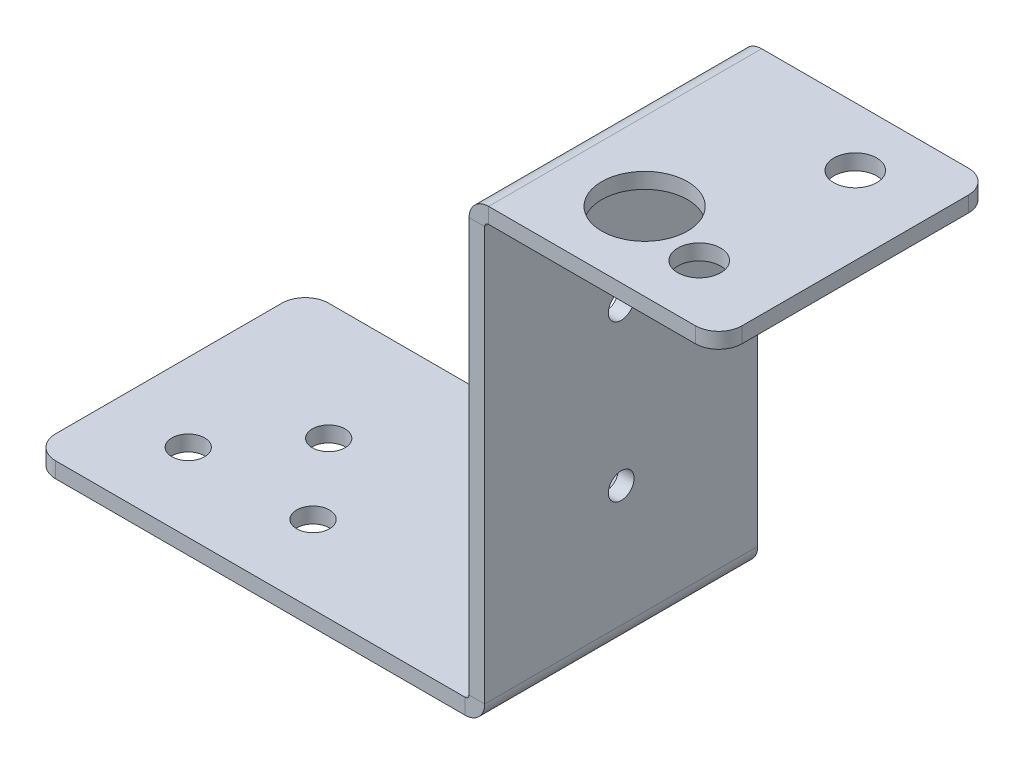
ISO-10303-21;
HEADER;
FILE_DESCRIPTION(('STEP AP214'),'2;1');
FILE_NAME('part.step','',(''),(''),'','','');
FILE_SCHEMA(('AUTOMOTIVE_DESIGN { 1 0 10303 214 1 1 1 1 }'));
ENDSEC;
DATA;
#1=APPLICATION_CONTEXT('core data for automotive mechanical design processes');
#2=APPLICATION_PROTOCOL_DEFINITION('international standard','automotive_design',2000,#1);
#3=PRODUCT_CONTEXT('',#1,'mechanical');
#4=PRODUCT('Part','Part','',(#3));
#5=PRODUCT_RELATED_PRODUCT_CATEGORY('part','',(#4));
#6=PRODUCT_DEFINITION_FORMATION('','',#4);
#7=PRODUCT_DEFINITION_CONTEXT('part definition',#1,'design');
#8=PRODUCT_DEFINITION('design','',#6,#7);
#9=PRODUCT_DEFINITION_SHAPE('','',#8);
#10=(LENGTH_UNIT() NAMED_UNIT(*) SI_UNIT(.MILLI.,.METRE.));
#11=(NAMED_UNIT(*) PLANE_ANGLE_UNIT() SI_UNIT($,.RADIAN.));
#12=(NAMED_UNIT(*) SI_UNIT($,.STERADIAN.) SOLID_ANGLE_UNIT());
#13=UNCERTAINTY_MEASURE_WITH_UNIT(LENGTH_MEASURE(1.E-05),#10,'distance_accuracy_value','');
#14=(GEOMETRIC_REPRESENTATION_CONTEXT(3) GLOBAL_UNCERTAINTY_ASSIGNED_CONTEXT((#13)) GLOBAL_UNIT_ASSIGNED_CONTEXT((#10,
#11,#12)) REPRESENTATION_CONTEXT('',''));
#15=CARTESIAN_POINT('',(0.,0.,0.));
#16=DIRECTION('',(0.,0.,1.));
#17=DIRECTION('',(1.,0.,0.));
#18=AXIS2_PLACEMENT_3D('',#15,#16,#17);
#19=CARTESIAN_POINT('',(298.690733397049,-705.243069828688,-3.));
#20=DIRECTION('',(0.,1.,0.));
#21=DIRECTION('',(0.,0.,1.));
#22=AXIS2_PLACEMENT_3D('',#19,#20,#21);
#23=CYLINDRICAL_SURFACE('',#22,3.);
#24=CARTESIAN_POINT('',(298.690733397049,-611.695268107402,-3.));
#25=DIRECTION('',(0.,1.,0.));
#26=DIRECTION('',(0.,0.,1.));
#27=AXIS2_PLACEMENT_3D('',#24,#25,#26);
#28=CIRCLE('',#27,3.);
#29=CARTESIAN_POINT('',(298.690733397049,-611.695268107402,0.));
#30=VERTEX_POINT('',#29);
#31=CARTESIAN_POINT('',(301.69073339705,-611.695268107402,-3.));
#32=VERTEX_POINT('',#31);
#33=EDGE_CURVE('E220',#30,#32,#28,.T.);
#34=ORIENTED_EDGE('',*,*,#33,.F.);
#35=DIRECTION('',(0.,1.,0.));
#36=VECTOR('',#35,1.);
#37=CARTESIAN_POINT('',(298.690733397049,-705.243069828688,0.));
#38=LINE('',#37,#36);
#39=CARTESIAN_POINT('',(298.690733397049,-613.695268107402,0.));
#40=VERTEX_POINT('',#39);
#41=EDGE_CURVE('E217',#40,#30,#38,.T.);
#42=ORIENTED_EDGE('',*,*,#41,.F.);
#43=CARTESIAN_POINT('',(298.690733397049,-613.695268107402,-3.));
#44=DIRECTION('',(0.,-1.,0.));
#45=DIRECTION('',(0.,0.,-1.));
#46=AXIS2_PLACEMENT_3D('',#43,#44,#45);
#47=CIRCLE('',#46,3.);
#48=CARTESIAN_POINT('',(301.690733397049,-613.695268107402,-3.));
#49=VERTEX_POINT('',#48);
#50=EDGE_CURVE('E11',#49,#40,#47,.T.);
#51=ORIENTED_EDGE('',*,*,#50,.F.);
#52=DIRECTION('',(0.,1.,0.));
#53=VECTOR('',#52,1.);
#54=CARTESIAN_POINT('',(301.69073339705,-705.243069828688,-3.));
#55=LINE('',#54,#53);
#56=EDGE_CURVE('E255',#49,#32,#55,.T.);
#57=ORIENTED_EDGE('',*,*,#56,.T.);
#58=EDGE_LOOP('',(#34,#42,#51,#57));
#59=FACE_BOUND('',#58,.T.);
#60=ADVANCED_FACE('F39',(#59),#23,.T.);
#61=CARTESIAN_POINT('',(301.69073339705,-705.243069828688,-35.));
#62=DIRECTION('',(-1.,0.,0.));
#63=DIRECTION('',(0.,0.,1.));
#64=AXIS2_PLACEMENT_3D('',#61,#62,#63);
#65=PLANE('',#64);
#66=DIRECTION('',(0.,0.,1.));
#67=VECTOR('',#66,1.);
#68=CARTESIAN_POINT('',(301.69073339705,-611.695268107402,-35.));
#69=LINE('',#68,#67);
#70=CARTESIAN_POINT('',(301.69073339705,-611.695268107402,-32.));
#71=VERTEX_POINT('',#70);
#72=EDGE_CURVE('E86',#71,#32,#69,.T.);
#73=ORIENTED_EDGE('',*,*,#72,.T.);
#74=ORIENTED_EDGE('',*,*,#56,.F.);
#75=DIRECTION('',(0.,0.,1.));
#76=VECTOR('',#75,1.);
#77=CARTESIAN_POINT('',(301.690733397049,-613.695268107402,-35.));
#78=LINE('',#77,#76);
#79=CARTESIAN_POINT('',(301.690733397049,-613.695268107402,-32.));
#80=VERTEX_POINT('',#79);
#81=EDGE_CURVE('E49',#80,#49,#78,.T.);
#82=ORIENTED_EDGE('',*,*,#81,.F.);
#83=DIRECTION('',(0.,1.,0.));
#84=VECTOR('',#83,1.);
#85=CARTESIAN_POINT('',(301.69073339705,-705.243069828688,-32.));
#86=LINE('',#85,#84);
#87=EDGE_CURVE('E251',#80,#71,#86,.T.);
#88=ORIENTED_EDGE('',*,*,#87,.T.);
#89=EDGE_LOOP('',(#73,#74,#82,#88));
#90=FACE_BOUND('',#89,.T.);
#91=ADVANCED_FACE('F263',(#90),#65,.F.);
#92=CARTESIAN_POINT('',(291.69073339705,-611.695268107402,-27.5000000000002));
#93=DIRECTION('',(0.,-1.,0.));
#94=DIRECTION('',(0.,0.,-1.));
#95=AXIS2_PLACEMENT_3D('',#92,#93,#94);
#96=CYLINDRICAL_SURFACE('',#95,2.74999999999992);
#97=CARTESIAN_POINT('',(291.690733397049,-613.695268107402,-27.5000000000002));
#98=DIRECTION('',(0.,-1.,0.));
#99=DIRECTION('',(0.,0.,-1.));
#100=AXIS2_PLACEMENT_3D('',#97,#98,#99);
#101=CIRCLE('',#100,2.74999999999992);
#102=CARTESIAN_POINT('',(291.690733397049,-613.695268107402,-30.2500000000002));
#103=VERTEX_POINT('',#102);
#104=EDGE_CURVE('E248',#103,#103,#101,.T.);
#105=ORIENTED_EDGE('',*,*,#104,.T.);
#106=EDGE_LOOP('',(#105));
#107=FACE_BOUND('',#106,.T.);
#108=CARTESIAN_POINT('',(291.69073339705,-611.695268107402,-27.5000000000002));
#109=DIRECTION('',(0.,-1.,0.));
#110=DIRECTION('',(0.,0.,-1.));
#111=AXIS2_PLACEMENT_3D('',#108,#109,#110);
#112=CIRCLE('',#111,2.74999999999992);
#113=CARTESIAN_POINT('',(291.69073339705,-611.695268107402,-30.2500000000002));
#114=VERTEX_POINT('',#113);
#115=EDGE_CURVE('E227',#114,#114,#112,.T.);
#116=ORIENTED_EDGE('',*,*,#115,.F.);
#117=EDGE_LOOP('',(#116));
#118=FACE_BOUND('',#117,.T.);
#119=ADVANCED_FACE('F438',(#107,#118),#96,.F.);
#120=CARTESIAN_POINT('',(291.69073339705,-611.695268107402,-7.50000000000001));
#121=DIRECTION('',(0.,-1.,0.));
#122=DIRECTION('',(0.,0.,-1.));
#123=AXIS2_PLACEMENT_3D('',#120,#121,#122);
#124=CYLINDRICAL_SURFACE('',#123,2.74999999999997);
#125=CARTESIAN_POINT('',(291.690733397049,-613.695268107402,-7.50000000000001));
#126=DIRECTION('',(0.,-1.,0.));
#127=DIRECTION('',(0.,0.,-1.));
#128=AXIS2_PLACEMENT_3D('',#125,#126,#127);
#129=CIRCLE('',#128,2.74999999999997);
#130=CARTESIAN_POINT('',(291.690733397049,-613.695268107402,-10.25));
#131=VERTEX_POINT('',#130);
#132=EDGE_CURVE('E245',#131,#131,#129,.T.);
#133=ORIENTED_EDGE('',*,*,#132,.T.);
#134=EDGE_LOOP('',(#133));
#135=FACE_BOUND('',#134,.T.);
#136=CARTESIAN_POINT('',(291.69073339705,-611.695268107402,-7.50000000000001));
#137=DIRECTION('',(0.,-1.,0.));
#138=DIRECTION('',(0.,0.,-1.));
#139=AXIS2_PLACEMENT_3D('',#136,#137,#138);
#140=CIRCLE('',#139,2.74999999999997);
#141=CARTESIAN_POINT('',(291.69073339705,-611.695268107402,-10.25));
#142=VERTEX_POINT('',#141);
#143=EDGE_CURVE('E230',#142,#142,#140,.T.);
#144=ORIENTED_EDGE('',*,*,#143,.F.);
#145=EDGE_LOOP('',(#144));
#146=FACE_BOUND('',#145,.T.);
#147=ADVANCED_FACE('F445',(#135,#146),#124,.F.);
#148=CARTESIAN_POINT('',(282.190733397049,-611.695268107402,-10.0000000000002));
#149=DIRECTION('',(0.,-1.,0.));
#150=DIRECTION('',(0.,0.,-1.));
#151=AXIS2_PLACEMENT_3D('',#148,#149,#150);
#152=CYLINDRICAL_SURFACE('',#151,5.50000000000001);
#153=CARTESIAN_POINT('',(282.190733397049,-613.695268107402,-10.0000000000002));
#154=DIRECTION('',(0.,-1.,0.));
#155=DIRECTION('',(0.,0.,-1.));
#156=AXIS2_PLACEMENT_3D('',#153,#154,#155);
#157=CIRCLE('',#156,5.50000000000001);
#158=CARTESIAN_POINT('',(282.190733397049,-613.695268107402,-15.5000000000002));
#159=VERTEX_POINT('',#158);
#160=EDGE_CURVE('E242',#159,#159,#157,.T.);
#161=ORIENTED_EDGE('',*,*,#160,.T.);
#162=EDGE_LOOP('',(#161));
#163=FACE_BOUND('',#162,.T.);
#164=CARTESIAN_POINT('',(282.190733397049,-611.695268107402,-10.0000000000002));
#165=DIRECTION('',(0.,-1.,0.));
#166=DIRECTION('',(0.,0.,-1.));
#167=AXIS2_PLACEMENT_3D('',#164,#165,#166);
#168=CIRCLE('',#167,5.50000000000001);
#169=CARTESIAN_POINT('',(282.190733397049,-611.695268107402,-15.5000000000002));
#170=VERTEX_POINT('',#169);
#171=EDGE_CURVE('E233',#170,#170,#168,.T.);
#172=ORIENTED_EDGE('',*,*,#171,.F.);
#173=EDGE_LOOP('',(#172));
#174=FACE_BOUND('',#173,.T.);
#175=ADVANCED_FACE('F449',(#163,#174),#152,.F.);
#176=CARTESIAN_POINT('',(298.690733397049,-705.243069828688,-32.));
#177=DIRECTION('',(0.,1.,0.));
#178=DIRECTION('',(0.,0.,1.));
#179=AXIS2_PLACEMENT_3D('',#176,#177,#178);
#180=CYLINDRICAL_SURFACE('',#179,3.);
#181=CARTESIAN_POINT('',(298.690733397049,-611.695268107402,-32.));
#182=DIRECTION('',(0.,1.,0.));
#183=DIRECTION('',(0.,0.,1.));
#184=AXIS2_PLACEMENT_3D('',#181,#182,#183);
#185=CIRCLE('',#184,3.);
#186=CARTESIAN_POINT('',(298.690733397049,-611.695268107402,-35.));
#187=VERTEX_POINT('',#186);
#188=EDGE_CURVE('E83',#71,#187,#185,.T.);
#189=ORIENTED_EDGE('',*,*,#188,.F.);
#190=ORIENTED_EDGE('',*,*,#87,.F.);
#191=CARTESIAN_POINT('',(298.690733397049,-613.695268107402,-32.));
#192=DIRECTION('',(0.,-1.,0.));
#193=DIRECTION('',(0.,0.,-1.));
#194=AXIS2_PLACEMENT_3D('',#191,#192,#193);
#195=CIRCLE('',#194,3.);
#196=CARTESIAN_POINT('',(298.690733397049,-613.695268107402,-35.));
#197=VERTEX_POINT('',#196);
#198=EDGE_CURVE('E208',#197,#80,#195,.T.);
#199=ORIENTED_EDGE('',*,*,#198,.F.);
#200=DIRECTION('',(0.,1.,0.));
#201=VECTOR('',#200,1.);
#202=CARTESIAN_POINT('',(298.690733397049,-705.243069828688,-35.));
#203=LINE('',#202,#201);
#204=EDGE_CURVE('E239',#197,#187,#203,.T.);
#205=ORIENTED_EDGE('',*,*,#204,.T.);
#206=EDGE_LOOP('',(#189,#190,#199,#205));
#207=FACE_BOUND('',#206,.T.);
#208=ADVANCED_FACE('F267',(#207),#180,.T.);
#209=CARTESIAN_POINT('',(298.690733397049,-705.243069828688,-35.));
#210=DIRECTION('',(0.,0.,1.));
#211=DIRECTION('',(1.,0.,0.));
#212=AXIS2_PLACEMENT_3D('',#209,#210,#211);
#213=PLANE('',#212);
#214=DIRECTION('',(-1.,0.,0.));
#215=VECTOR('',#214,1.);
#216=CARTESIAN_POINT('',(298.690733397049,-611.695268107402,-35.));
#217=LINE('',#216,#215);
#218=CARTESIAN_POINT('',(272.190733397049,-611.695268107402,-35.));
#219=VERTEX_POINT('',#218);
#220=EDGE_CURVE('E224',#187,#219,#217,.T.);
#221=ORIENTED_EDGE('',*,*,#220,.F.);
#222=ORIENTED_EDGE('',*,*,#204,.F.);
#223=DIRECTION('',(1.,0.,0.));
#224=VECTOR('',#223,1.);
#225=CARTESIAN_POINT('',(298.690733397049,-613.695268107402,-35.));
#226=LINE('',#225,#224);
#227=CARTESIAN_POINT('',(272.190733397049,-613.695268107402,-35.));
#228=VERTEX_POINT('',#227);
#229=EDGE_CURVE('E210',#228,#197,#226,.T.);
#230=ORIENTED_EDGE('',*,*,#229,.F.);
#231=DIRECTION('',(0.,1.,0.));
#232=VECTOR('',#231,1.);
#233=CARTESIAN_POINT('',(272.190733397049,-705.243069828688,-35.));
#234=LINE('',#233,#232);
#235=EDGE_CURVE('E236',#228,#219,#234,.T.);
#236=ORIENTED_EDGE('',*,*,#235,.T.);
#237=EDGE_LOOP('',(#221,#222,#230,#236));
#238=FACE_BOUND('',#237,.T.);
#239=ADVANCED_FACE('F271',(#238),#213,.F.);
#240=CARTESIAN_POINT('',(298.690733397049,-611.695268107402,-35.));
#241=DIRECTION('',(0.,1.,0.));
#242=DIRECTION('',(0.,0.,1.));
#243=AXIS2_PLACEMENT_3D('',#240,#241,#242);
#244=PLANE('',#243);
#245=ORIENTED_EDGE('',*,*,#171,.T.);
#246=EDGE_LOOP('',(#245));
#247=FACE_BOUND('',#246,.T.);
#248=ORIENTED_EDGE('',*,*,#143,.T.);
#249=EDGE_LOOP('',(#248));
#250=FACE_BOUND('',#249,.T.);
#251=ORIENTED_EDGE('',*,*,#115,.T.);
#252=EDGE_LOOP('',(#251));
#253=FACE_BOUND('',#252,.T.);
#254=ORIENTED_EDGE('',*,*,#72,.F.);
#255=ORIENTED_EDGE('',*,*,#188,.T.);
#256=ORIENTED_EDGE('',*,*,#220,.T.);
#257=DIRECTION('',(0.,0.,1.));
#258=VECTOR('',#257,1.);
#259=CARTESIAN_POINT('',(272.190733397049,-611.695268107402,-35.));
#260=LINE('',#259,#258);
#261=CARTESIAN_POINT('',(272.190733397049,-611.695268107402,0.));
#262=VERTEX_POINT('',#261);
#263=EDGE_CURVE('E222',#219,#262,#260,.T.);
#264=ORIENTED_EDGE('',*,*,#263,.T.);
#265=DIRECTION('',(-1.,0.,0.));
#266=VECTOR('',#265,1.);
#267=CARTESIAN_POINT('',(298.690733397049,-611.695268107402,0.));
#268=LINE('',#267,#266);
#269=EDGE_CURVE('E214',#30,#262,#268,.T.);
#270=ORIENTED_EDGE('',*,*,#269,.F.);
#271=ORIENTED_EDGE('',*,*,#33,.T.);
#272=EDGE_LOOP('',(#254,#255,#256,#264,#270,#271));
#273=FACE_BOUND('',#272,.T.);
#274=ADVANCED_FACE('F272',(#247,#250,#253,#273),#244,.T.);
#275=CARTESIAN_POINT('',(301.69073339705,-705.243069828688,0.));
#276=DIRECTION('',(0.,0.,1.));
#277=DIRECTION('',(1.,0.,0.));
#278=AXIS2_PLACEMENT_3D('',#275,#276,#277);
#279=PLANE('',#278);
#280=ORIENTED_EDGE('',*,*,#41,.T.);
#281=ORIENTED_EDGE('',*,*,#269,.T.);
#282=DIRECTION('',(0.,1.,0.));
#283=VECTOR('',#282,1.);
#284=CARTESIAN_POINT('',(272.190733397049,-705.243069828688,0.));
#285=LINE('',#284,#283);
#286=CARTESIAN_POINT('',(272.190733397049,-613.695268107402,0.));
#287=VERTEX_POINT('',#286);
#288=EDGE_CURVE('E184',#287,#262,#285,.T.);
#289=ORIENTED_EDGE('',*,*,#288,.F.);
#290=DIRECTION('',(1.,0.,0.));
#291=VECTOR('',#290,1.);
#292=CARTESIAN_POINT('',(301.690733397049,-613.695268107402,0.));
#293=LINE('',#292,#291);
#294=EDGE_CURVE('E212',#287,#40,#293,.T.);
#295=ORIENTED_EDGE('',*,*,#294,.T.);
#296=EDGE_LOOP('',(#280,#281,#289,#295));
#297=FACE_BOUND('',#296,.T.);
#298=ADVANCED_FACE('F274',(#297),#279,.T.);
#299=CARTESIAN_POINT('',(301.690733397049,-613.695268107402,-35.));
#300=DIRECTION('',(0.,-1.,0.));
#301=DIRECTION('',(0.,0.,-1.));
#302=AXIS2_PLACEMENT_3D('',#299,#300,#301);
#303=PLANE('',#302);
#304=ORIENTED_EDGE('',*,*,#160,.F.);
#305=EDGE_LOOP('',(#304));
#306=FACE_BOUND('',#305,.T.);
#307=ORIENTED_EDGE('',*,*,#132,.F.);
#308=EDGE_LOOP('',(#307));
#309=FACE_BOUND('',#308,.T.);
#310=ORIENTED_EDGE('',*,*,#104,.F.);
#311=EDGE_LOOP('',(#310));
#312=FACE_BOUND('',#311,.T.);
#313=ORIENTED_EDGE('',*,*,#229,.T.);
#314=ORIENTED_EDGE('',*,*,#198,.T.);
#315=ORIENTED_EDGE('',*,*,#81,.T.);
#316=ORIENTED_EDGE('',*,*,#50,.T.);
#317=ORIENTED_EDGE('',*,*,#294,.F.);
#318=DIRECTION('',(0.,0.,1.));
#319=VECTOR('',#318,1.);
#320=CARTESIAN_POINT('',(272.190733397049,-613.695268107402,-35.));
#321=LINE('',#320,#319);
#322=EDGE_CURVE('E43',#228,#287,#321,.T.);
#323=ORIENTED_EDGE('',*,*,#322,.F.);
#324=EDGE_LOOP('',(#313,#314,#315,#316,#317,#323));
#325=FACE_BOUND('',#324,.T.);
#326=ADVANCED_FACE('F41',(#306,#309,#312,#325),#303,.T.);
#327=CARTESIAN_POINT('',(304.690733397049,-631.695268107402,-17.5));
#328=DIRECTION('',(-1.,0.,0.));
#329=DIRECTION('',(0.,-1.,0.));
#330=AXIS2_PLACEMENT_3D('',#327,#328,#329);
#331=CYLINDRICAL_SURFACE('',#330,1.64999999999999);
#332=CARTESIAN_POINT('',(271.69073339705,-631.695268107402,-17.5));
#333=DIRECTION('',(1.,0.,0.));
#334=DIRECTION('',(0.,1.,0.));
#335=AXIS2_PLACEMENT_3D('',#332,#333,#334);
#336=CIRCLE('',#335,1.64999999999999);
#337=CARTESIAN_POINT('',(271.69073339705,-630.045268107402,-17.5));
#338=VERTEX_POINT('',#337);
#339=EDGE_CURVE('E370',#338,#338,#336,.T.);
#340=ORIENTED_EDGE('',*,*,#339,.T.);
#341=EDGE_LOOP('',(#340));
#342=FACE_BOUND('',#341,.T.);
#343=CARTESIAN_POINT('',(269.69073339705,-631.695268107402,-17.5));
#344=DIRECTION('',(-1.,0.,0.));
#345=DIRECTION('',(0.,-1.,0.));
#346=AXIS2_PLACEMENT_3D('',#343,#344,#345);
#347=CIRCLE('',#346,1.64999999999999);
#348=CARTESIAN_POINT('',(269.69073339705,-633.345268107402,-17.5));
#349=VERTEX_POINT('',#348);
#350=EDGE_CURVE('E194',#349,#349,#347,.T.);
#351=ORIENTED_EDGE('',*,*,#350,.T.);
#352=EDGE_LOOP('',(#351));
#353=FACE_BOUND('',#352,.T.);
#354=ADVANCED_FACE('F464',(#342,#353),#331,.F.);
#355=CARTESIAN_POINT('',(271.690733397049,-667.195268107402,-35.));
#356=DIRECTION('',(1.,0.,0.));
#357=DIRECTION('',(0.,1.,0.));
#358=AXIS2_PLACEMENT_3D('',#355,#356,#357);
#359=PLANE('',#358);
#360=CARTESIAN_POINT('',(271.690733397049,-651.695268107402,-17.5));
#361=DIRECTION('',(1.,0.,0.));
#362=DIRECTION('',(0.,1.,0.));
#363=AXIS2_PLACEMENT_3D('',#360,#361,#362);
#364=CIRCLE('',#363,1.64999999999999);
#365=CARTESIAN_POINT('',(271.690733397049,-650.045268107402,-17.5));
#366=VERTEX_POINT('',#365);
#367=EDGE_CURVE('E367',#366,#366,#364,.T.);
#368=ORIENTED_EDGE('',*,*,#367,.F.);
#369=EDGE_LOOP('',(#368));
#370=FACE_BOUND('',#369,.T.);
#371=ORIENTED_EDGE('',*,*,#339,.F.);
#372=EDGE_LOOP('',(#371));
#373=FACE_BOUND('',#372,.T.);
#374=DIRECTION('',(0.,1.,0.));
#375=VECTOR('',#374,1.);
#376=CARTESIAN_POINT('',(271.690733397049,-667.195268107402,0.));
#377=LINE('',#376,#375);
#378=CARTESIAN_POINT('',(271.690733397049,-667.195268107402,0.));
#379=VERTEX_POINT('',#378);
#380=CARTESIAN_POINT('',(271.690733397049,-614.195268107402,0.));
#381=VERTEX_POINT('',#380);
#382=EDGE_CURVE('E198',#379,#381,#377,.T.);
#383=ORIENTED_EDGE('',*,*,#382,.F.);
#384=DIRECTION('',(0.,0.,1.));
#385=VECTOR('',#384,1.);
#386=CARTESIAN_POINT('',(271.690733397049,-667.195268107402,-35.));
#387=LINE('',#386,#385);
#388=CARTESIAN_POINT('',(271.690733397049,-667.195268107402,-35.));
#389=VERTEX_POINT('',#388);
#390=EDGE_CURVE('E374',#389,#379,#387,.T.);
#391=ORIENTED_EDGE('',*,*,#390,.F.);
#392=DIRECTION('',(0.,1.,0.));
#393=VECTOR('',#392,1.);
#394=CARTESIAN_POINT('',(271.690733397049,-667.195268107402,-35.));
#395=LINE('',#394,#393);
#396=CARTESIAN_POINT('',(271.690733397049,-614.195268107402,-35.));
#397=VERTEX_POINT('',#396);
#398=EDGE_CURVE('E377',#389,#397,#395,.T.);
#399=ORIENTED_EDGE('',*,*,#398,.T.);
#400=DIRECTION('',(0.,0.,1.));
#401=VECTOR('',#400,1.);
#402=CARTESIAN_POINT('',(271.690733397049,-614.195268107402,-35.));
#403=LINE('',#402,#401);
#404=EDGE_CURVE('E279',#397,#381,#403,.T.);
#405=ORIENTED_EDGE('',*,*,#404,.T.);
#406=EDGE_LOOP('',(#383,#391,#399,#405));
#407=FACE_BOUND('',#406,.T.);
#408=ADVANCED_FACE('F469',(#370,#373,#407),#359,.T.);
#409=CARTESIAN_POINT('',(304.690733397049,-651.695268107402,-17.5));
#410=DIRECTION('',(-1.,0.,0.));
#411=DIRECTION('',(0.,-1.,0.));
#412=AXIS2_PLACEMENT_3D('',#409,#410,#411);
#413=CYLINDRICAL_SURFACE('',#412,1.64999999999999);
#414=ORIENTED_EDGE('',*,*,#367,.T.);
#415=EDGE_LOOP('',(#414));
#416=FACE_BOUND('',#415,.T.);
#417=CARTESIAN_POINT('',(269.690733397049,-651.695268107402,-17.5));
#418=DIRECTION('',(-1.,0.,0.));
#419=DIRECTION('',(0.,-1.,0.));
#420=AXIS2_PLACEMENT_3D('',#417,#418,#419);
#421=CIRCLE('',#420,1.64999999999999);
#422=CARTESIAN_POINT('',(269.690733397049,-653.345268107402,-17.5));
#423=VERTEX_POINT('',#422);
#424=EDGE_CURVE('E299',#423,#423,#421,.T.);
#425=ORIENTED_EDGE('',*,*,#424,.T.);
#426=EDGE_LOOP('',(#425));
#427=FACE_BOUND('',#426,.T.);
#428=ADVANCED_FACE('F488',(#416,#427),#413,.F.);
#429=CARTESIAN_POINT('',(269.690733397049,-667.195268107402,-35.));
#430=DIRECTION('',(-1.,0.,0.));
#431=DIRECTION('',(0.,-1.,0.));
#432=AXIS2_PLACEMENT_3D('',#429,#430,#431);
#433=PLANE('',#432);
#434=ORIENTED_EDGE('',*,*,#424,.F.);
#435=EDGE_LOOP('',(#434));
#436=FACE_BOUND('',#435,.T.);
#437=ORIENTED_EDGE('',*,*,#350,.F.);
#438=EDGE_LOOP('',(#437));
#439=FACE_BOUND('',#438,.T.);
#440=DIRECTION('',(0.,-1.,0.));
#441=VECTOR('',#440,1.);
#442=CARTESIAN_POINT('',(269.690733397049,-667.195268107402,0.));
#443=LINE('',#442,#441);
#444=CARTESIAN_POINT('',(269.690733397049,-614.195268107402,0.));
#445=VERTEX_POINT('',#444);
#446=CARTESIAN_POINT('',(269.690733397049,-667.195268107402,0.));
#447=VERTEX_POINT('',#446);
#448=EDGE_CURVE('E176',#445,#447,#443,.T.);
#449=ORIENTED_EDGE('',*,*,#448,.F.);
#450=DIRECTION('',(0.,0.,1.));
#451=VECTOR('',#450,1.);
#452=CARTESIAN_POINT('',(269.690733397049,-614.195268107402,-35.));
#453=LINE('',#452,#451);
#454=CARTESIAN_POINT('',(269.690733397049,-614.195268107402,-35.));
#455=VERTEX_POINT('',#454);
#456=EDGE_CURVE('E166',#455,#445,#453,.T.);
#457=ORIENTED_EDGE('',*,*,#456,.F.);
#458=DIRECTION('',(0.,-1.,0.));
#459=VECTOR('',#458,1.);
#460=CARTESIAN_POINT('',(269.690733397049,-667.195268107402,-35.));
#461=LINE('',#460,#459);
#462=CARTESIAN_POINT('',(269.690733397049,-667.195268107402,-35.));
#463=VERTEX_POINT('',#462);
#464=EDGE_CURVE('E175',#455,#463,#461,.T.);
#465=ORIENTED_EDGE('',*,*,#464,.T.);
#466=DIRECTION('',(0.,0.,1.));
#467=VECTOR('',#466,1.);
#468=CARTESIAN_POINT('',(269.690733397049,-667.195268107402,-35.));
#469=LINE('',#468,#467);
#470=EDGE_CURVE('E190',#463,#447,#469,.T.);
#471=ORIENTED_EDGE('',*,*,#470,.T.);
#472=EDGE_LOOP('',(#449,#457,#465,#471));
#473=FACE_BOUND('',#472,.T.);
#474=ADVANCED_FACE('F188',(#436,#439,#473),#433,.T.);
#475=CARTESIAN_POINT('',(144.663177331446,-667.195268107401,0.));
#476=DIRECTION('',(0.,0.,1.));
#477=DIRECTION('',(0.,1.,0.));
#478=AXIS2_PLACEMENT_3D('',#475,#476,#477);
#479=PLANE('',#478);
#480=DIRECTION('',(1.,0.,0.));
#481=VECTOR('',#480,1.);
#482=CARTESIAN_POINT('',(144.663177331446,-667.195268107401,0.));
#483=LINE('',#482,#481);
#484=EDGE_CURVE('E381',#447,#379,#483,.T.);
#485=ORIENTED_EDGE('',*,*,#484,.T.);
#486=ORIENTED_EDGE('',*,*,#382,.T.);
#487=DIRECTION('',(1.,0.,0.));
#488=VECTOR('',#487,1.);
#489=CARTESIAN_POINT('',(144.663177331446,-614.195268107401,0.));
#490=LINE('',#489,#488);
#491=EDGE_CURVE('E181',#445,#381,#490,.T.);
#492=ORIENTED_EDGE('',*,*,#491,.F.);
#493=ORIENTED_EDGE('',*,*,#448,.T.);
#494=EDGE_LOOP('',(#485,#486,#492,#493));
#495=FACE_BOUND('',#494,.T.);
#496=ADVANCED_FACE('F197',(#495),#479,.T.);
#497=CARTESIAN_POINT('',(144.663177331446,-667.195268107401,-35.));
#498=DIRECTION('',(0.,0.,1.));
#499=DIRECTION('',(0.,1.,0.));
#500=AXIS2_PLACEMENT_3D('',#497,#498,#499);
#501=PLANE('',#500);
#502=ORIENTED_EDGE('',*,*,#398,.F.);
#503=DIRECTION('',(1.,0.,0.));
#504=VECTOR('',#503,1.);
#505=CARTESIAN_POINT('',(144.663177331446,-667.195268107401,-35.));
#506=LINE('',#505,#504);
#507=EDGE_CURVE('E101',#463,#389,#506,.T.);
#508=ORIENTED_EDGE('',*,*,#507,.F.);
#509=ORIENTED_EDGE('',*,*,#464,.F.);
#510=DIRECTION('',(1.,0.,0.));
#511=VECTOR('',#510,1.);
#512=CARTESIAN_POINT('',(144.663177331446,-614.195268107401,-35.));
#513=LINE('',#512,#511);
#514=EDGE_CURVE('E200',#455,#397,#513,.T.);
#515=ORIENTED_EDGE('',*,*,#514,.T.);
#516=EDGE_LOOP('',(#502,#508,#509,#515));
#517=FACE_BOUND('',#516,.T.);
#518=ADVANCED_FACE('F493',(#517),#501,.F.);
#519=CARTESIAN_POINT('',(213.690733397049,-538.466460294483,-35.));
#520=DIRECTION('',(1.,0.,0.));
#521=DIRECTION('',(0.,0.,-1.));
#522=AXIS2_PLACEMENT_3D('',#519,#520,#521);
#523=PLANE('',#522);
#524=DIRECTION('',(0.,0.,1.));
#525=VECTOR('',#524,1.);
#526=CARTESIAN_POINT('',(213.690733397049,-669.695268107402,-35.));
#527=LINE('',#526,#525);
#528=CARTESIAN_POINT('',(213.690733397049,-669.695268107402,-32.));
#529=VERTEX_POINT('',#528);
#530=CARTESIAN_POINT('',(213.690733397049,-669.695268107402,-3.));
#531=VERTEX_POINT('',#530);
#532=EDGE_CURVE('E353',#529,#531,#527,.T.);
#533=ORIENTED_EDGE('',*,*,#532,.T.);
#534=DIRECTION('',(0.,-1.,0.));
#535=VECTOR('',#534,1.);
#536=CARTESIAN_POINT('',(213.690733397049,-538.466460294483,-3.));
#537=LINE('',#536,#535);
#538=CARTESIAN_POINT('',(213.690733397049,-667.695268107402,-3.));
#539=VERTEX_POINT('',#538);
#540=EDGE_CURVE('E326',#539,#531,#537,.T.);
#541=ORIENTED_EDGE('',*,*,#540,.F.);
#542=DIRECTION('',(0.,0.,1.));
#543=VECTOR('',#542,1.);
#544=CARTESIAN_POINT('',(213.690733397049,-667.695268107402,-35.));
#545=LINE('',#544,#543);
#546=CARTESIAN_POINT('',(213.690733397049,-667.695268107402,-32.));
#547=VERTEX_POINT('',#546);
#548=EDGE_CURVE('E311',#547,#539,#545,.T.);
#549=ORIENTED_EDGE('',*,*,#548,.F.);
#550=DIRECTION('',(0.,-1.,0.));
#551=VECTOR('',#550,1.);
#552=CARTESIAN_POINT('',(213.690733397049,-538.466460294483,-32.));
#553=LINE('',#552,#551);
#554=EDGE_CURVE('E350',#547,#529,#553,.T.);
#555=ORIENTED_EDGE('',*,*,#554,.T.);
#556=EDGE_LOOP('',(#533,#541,#549,#555));
#557=FACE_BOUND('',#556,.T.);
#558=ADVANCED_FACE('F419',(#557),#523,.F.);
#559=CARTESIAN_POINT('',(216.690733397049,-538.466460294483,-32.));
#560=DIRECTION('',(0.,-1.,0.));
#561=DIRECTION('',(0.,0.,-1.));
#562=AXIS2_PLACEMENT_3D('',#559,#560,#561);
#563=CYLINDRICAL_SURFACE('',#562,3.);
#564=CARTESIAN_POINT('',(216.690733397049,-669.695268107402,-32.));
#565=DIRECTION('',(0.,-1.,0.));
#566=DIRECTION('',(0.,0.,-1.));
#567=AXIS2_PLACEMENT_3D('',#564,#565,#566);
#568=CIRCLE('',#567,3.);
#569=CARTESIAN_POINT('',(216.690733397049,-669.695268107402,-35.));
#570=VERTEX_POINT('',#569);
#571=EDGE_CURVE('E304',#529,#570,#568,.T.);
#572=ORIENTED_EDGE('',*,*,#571,.F.);
#573=ORIENTED_EDGE('',*,*,#554,.F.);
#574=CARTESIAN_POINT('',(216.690733397049,-667.695268107402,-32.));
#575=DIRECTION('',(0.,1.,0.));
#576=DIRECTION('',(0.,0.,1.));
#577=AXIS2_PLACEMENT_3D('',#574,#575,#576);
#578=CIRCLE('',#577,3.);
#579=CARTESIAN_POINT('',(216.690733397049,-667.695268107402,-35.));
#580=VERTEX_POINT('',#579);
#581=EDGE_CURVE('E313',#580,#547,#578,.T.);
#582=ORIENTED_EDGE('',*,*,#581,.F.);
#583=DIRECTION('',(0.,-1.,0.));
#584=VECTOR('',#583,1.);
#585=CARTESIAN_POINT('',(216.690733397049,-538.466460294483,-35.));
#586=LINE('',#585,#584);
#587=EDGE_CURVE('E347',#580,#570,#586,.T.);
#588=ORIENTED_EDGE('',*,*,#587,.T.);
#589=EDGE_LOOP('',(#572,#573,#582,#588));
#590=FACE_BOUND('',#589,.T.);
#591=ADVANCED_FACE('F413',(#590),#563,.T.);
#592=CARTESIAN_POINT('',(231.690733397049,-611.695268107402,-20.0000000000002));
#593=DIRECTION('',(0.,-1.,0.));
#594=DIRECTION('',(0.,0.,-1.));
#595=AXIS2_PLACEMENT_3D('',#592,#593,#594);
#596=CYLINDRICAL_SURFACE('',#595,2.10000000000002);
#597=CARTESIAN_POINT('',(231.690733397049,-669.695268107402,-20.0000000000002));
#598=DIRECTION('',(0.,-1.,0.));
#599=DIRECTION('',(0.,0.,-1.));
#600=AXIS2_PLACEMENT_3D('',#597,#598,#599);
#601=CIRCLE('',#600,2.10000000000002);
#602=CARTESIAN_POINT('',(231.690733397049,-669.695268107402,-22.1000000000002));
#603=VERTEX_POINT('',#602);
#604=EDGE_CURVE('E344',#603,#603,#601,.T.);
#605=ORIENTED_EDGE('',*,*,#604,.T.);
#606=EDGE_LOOP('',(#605));
#607=FACE_BOUND('',#606,.T.);
#608=CARTESIAN_POINT('',(231.690733397049,-667.695268107402,-20.0000000000002));
#609=DIRECTION('',(0.,1.,0.));
#610=DIRECTION('',(0.,0.,1.));
#611=AXIS2_PLACEMENT_3D('',#608,#609,#610);
#612=CIRCLE('',#611,2.10000000000002);
#613=CARTESIAN_POINT('',(231.690733397049,-667.695268107402,-17.9000000000002));
#614=VERTEX_POINT('',#613);
#615=EDGE_CURVE('E341',#614,#614,#612,.T.);
#616=ORIENTED_EDGE('',*,*,#615,.T.);
#617=EDGE_LOOP('',(#616));
#618=FACE_BOUND('',#617,.T.);
#619=ADVANCED_FACE('F522',(#607,#618),#596,.F.);
#620=CARTESIAN_POINT('',(239.690733397049,-611.695268107402,-10.0000000000002));
#621=DIRECTION('',(0.,-1.,0.));
#622=DIRECTION('',(0.,0.,-1.));
#623=AXIS2_PLACEMENT_3D('',#620,#621,#622);
#624=CYLINDRICAL_SURFACE('',#623,2.09999999999999);
#625=CARTESIAN_POINT('',(239.690733397049,-669.695268107402,-10.0000000000002));
#626=DIRECTION('',(0.,-1.,0.));
#627=DIRECTION('',(0.,0.,-1.));
#628=AXIS2_PLACEMENT_3D('',#625,#626,#627);
#629=CIRCLE('',#628,2.09999999999999);
#630=CARTESIAN_POINT('',(239.690733397049,-669.695268107402,-12.1000000000002));
#631=VERTEX_POINT('',#630);
#632=EDGE_CURVE('E338',#631,#631,#629,.T.);
#633=ORIENTED_EDGE('',*,*,#632,.T.);
#634=EDGE_LOOP('',(#633));
#635=FACE_BOUND('',#634,.T.);
#636=CARTESIAN_POINT('',(239.690733397049,-667.695268107402,-10.0000000000002));
#637=DIRECTION('',(0.,1.,0.));
#638=DIRECTION('',(0.,0.,1.));
#639=AXIS2_PLACEMENT_3D('',#636,#637,#638);
#640=CIRCLE('',#639,2.09999999999999);
#641=CARTESIAN_POINT('',(239.690733397049,-667.695268107402,-7.90000000000019));
#642=VERTEX_POINT('',#641);
#643=EDGE_CURVE('E335',#642,#642,#640,.T.);
#644=ORIENTED_EDGE('',*,*,#643,.T.);
#645=EDGE_LOOP('',(#644));
#646=FACE_BOUND('',#645,.T.);
#647=ADVANCED_FACE('F430',(#635,#646),#624,.F.);
#648=CARTESIAN_POINT('',(223.690733397049,-611.695268107402,-10.0000000000002));
#649=DIRECTION('',(0.,-1.,0.));
#650=DIRECTION('',(0.,0.,-1.));
#651=AXIS2_PLACEMENT_3D('',#648,#649,#650);
#652=CYLINDRICAL_SURFACE('',#651,2.10000000000002);
#653=CARTESIAN_POINT('',(223.690733397049,-669.695268107402,-10.0000000000002));
#654=DIRECTION('',(0.,-1.,0.));
#655=DIRECTION('',(0.,0.,-1.));
#656=AXIS2_PLACEMENT_3D('',#653,#654,#655);
#657=CIRCLE('',#656,2.10000000000002);
#658=CARTESIAN_POINT('',(223.690733397049,-669.695268107402,-12.1000000000002));
#659=VERTEX_POINT('',#658);
#660=EDGE_CURVE('E332',#659,#659,#657,.T.);
#661=ORIENTED_EDGE('',*,*,#660,.T.);
#662=EDGE_LOOP('',(#661));
#663=FACE_BOUND('',#662,.T.);
#664=CARTESIAN_POINT('',(223.690733397049,-667.695268107402,-10.0000000000002));
#665=DIRECTION('',(0.,1.,0.));
#666=DIRECTION('',(0.,0.,1.));
#667=AXIS2_PLACEMENT_3D('',#664,#665,#666);
#668=CIRCLE('',#667,2.10000000000002);
#669=CARTESIAN_POINT('',(223.690733397049,-667.695268107402,-7.90000000000016));
#670=VERTEX_POINT('',#669);
#671=EDGE_CURVE('E329',#670,#670,#668,.T.);
#672=ORIENTED_EDGE('',*,*,#671,.T.);
#673=EDGE_LOOP('',(#672));
#674=FACE_BOUND('',#673,.T.);
#675=ADVANCED_FACE('F423',(#663,#674),#652,.F.);
#676=CARTESIAN_POINT('',(216.690733397049,-538.466460294483,-3.));
#677=DIRECTION('',(0.,-1.,0.));
#678=DIRECTION('',(0.,0.,-1.));
#679=AXIS2_PLACEMENT_3D('',#676,#677,#678);
#680=CYLINDRICAL_SURFACE('',#679,3.);
#681=CARTESIAN_POINT('',(216.690733397049,-669.695268107402,-3.));
#682=DIRECTION('',(0.,-1.,0.));
#683=DIRECTION('',(0.,0.,-1.));
#684=AXIS2_PLACEMENT_3D('',#681,#682,#683);
#685=CIRCLE('',#684,3.);
#686=CARTESIAN_POINT('',(216.690733397049,-669.695268107402,0.));
#687=VERTEX_POINT('',#686);
#688=EDGE_CURVE('E297',#687,#531,#685,.T.);
#689=ORIENTED_EDGE('',*,*,#688,.F.);
#690=DIRECTION('',(0.,-1.,0.));
#691=VECTOR('',#690,1.);
#692=CARTESIAN_POINT('',(216.690733397049,-538.466460294483,0.));
#693=LINE('',#692,#691);
#694=CARTESIAN_POINT('',(216.690733397049,-667.695268107402,0.));
#695=VERTEX_POINT('',#694);
#696=EDGE_CURVE('E323',#695,#687,#693,.T.);
#697=ORIENTED_EDGE('',*,*,#696,.F.);
#698=CARTESIAN_POINT('',(216.690733397049,-667.695268107402,-3.));
#699=DIRECTION('',(0.,1.,0.));
#700=DIRECTION('',(0.,0.,1.));
#701=AXIS2_PLACEMENT_3D('',#698,#699,#700);
#702=CIRCLE('',#701,3.);
#703=EDGE_CURVE('E309',#539,#695,#702,.T.);
#704=ORIENTED_EDGE('',*,*,#703,.F.);
#705=ORIENTED_EDGE('',*,*,#540,.T.);
#706=EDGE_LOOP('',(#689,#697,#704,#705));
#707=FACE_BOUND('',#706,.T.);
#708=ADVANCED_FACE('F421',(#707),#680,.T.);
#709=CARTESIAN_POINT('',(213.690733397049,-538.466460294483,0.));
#710=DIRECTION('',(0.,0.,1.));
#711=DIRECTION('',(1.,0.,0.));
#712=AXIS2_PLACEMENT_3D('',#709,#710,#711);
#713=PLANE('',#712);
#714=ORIENTED_EDGE('',*,*,#696,.T.);
#715=DIRECTION('',(1.,0.,0.));
#716=VECTOR('',#715,1.);
#717=CARTESIAN_POINT('',(269.190733397049,-669.695268107402,0.));
#718=LINE('',#717,#716);
#719=CARTESIAN_POINT('',(269.190733397049,-669.695268107402,0.));
#720=VERTEX_POINT('',#719);
#721=EDGE_CURVE('E320',#687,#720,#718,.T.);
#722=ORIENTED_EDGE('',*,*,#721,.T.);
#723=DIRECTION('',(0.,-1.,0.));
#724=VECTOR('',#723,1.);
#725=CARTESIAN_POINT('',(269.190733397049,-538.466460294483,0.));
#726=LINE('',#725,#724);
#727=CARTESIAN_POINT('',(269.190733397049,-667.695268107402,0.));
#728=VERTEX_POINT('',#727);
#729=EDGE_CURVE('E291',#728,#720,#726,.T.);
#730=ORIENTED_EDGE('',*,*,#729,.F.);
#731=DIRECTION('',(-1.,0.,0.));
#732=VECTOR('',#731,1.);
#733=CARTESIAN_POINT('',(213.690733397049,-667.695268107402,0.));
#734=LINE('',#733,#732);
#735=EDGE_CURVE('E317',#728,#695,#734,.T.);
#736=ORIENTED_EDGE('',*,*,#735,.T.);
#737=EDGE_LOOP('',(#714,#722,#730,#736));
#738=FACE_BOUND('',#737,.T.);
#739=ADVANCED_FACE('F397',(#738),#713,.T.);
#740=CARTESIAN_POINT('',(213.690733397049,-667.695268107402,-35.));
#741=DIRECTION('',(0.,1.,0.));
#742=DIRECTION('',(0.,0.,1.));
#743=AXIS2_PLACEMENT_3D('',#740,#741,#742);
#744=PLANE('',#743);
#745=ORIENTED_EDGE('',*,*,#671,.F.);
#746=EDGE_LOOP('',(#745));
#747=FACE_BOUND('',#746,.T.);
#748=ORIENTED_EDGE('',*,*,#643,.F.);
#749=EDGE_LOOP('',(#748));
#750=FACE_BOUND('',#749,.T.);
#751=ORIENTED_EDGE('',*,*,#615,.F.);
#752=EDGE_LOOP('',(#751));
#753=FACE_BOUND('',#752,.T.);
#754=DIRECTION('',(-1.,0.,0.));
#755=VECTOR('',#754,1.);
#756=CARTESIAN_POINT('',(269.190733397049,-667.695268107402,-35.));
#757=LINE('',#756,#755);
#758=CARTESIAN_POINT('',(269.190733397049,-667.695268107402,-35.));
#759=VERTEX_POINT('',#758);
#760=EDGE_CURVE('E315',#759,#580,#757,.T.);
#761=ORIENTED_EDGE('',*,*,#760,.T.);
#762=ORIENTED_EDGE('',*,*,#581,.T.);
#763=ORIENTED_EDGE('',*,*,#548,.T.);
#764=ORIENTED_EDGE('',*,*,#703,.T.);
#765=ORIENTED_EDGE('',*,*,#735,.F.);
#766=DIRECTION('',(0.,0.,1.));
#767=VECTOR('',#766,1.);
#768=CARTESIAN_POINT('',(269.190733397049,-667.695268107402,-35.));
#769=LINE('',#768,#767);
#770=EDGE_CURVE('E356',#759,#728,#769,.T.);
#771=ORIENTED_EDGE('',*,*,#770,.F.);
#772=EDGE_LOOP('',(#761,#762,#763,#764,#765,#771));
#773=FACE_BOUND('',#772,.T.);
#774=ADVANCED_FACE('F406',(#747,#750,#753,#773),#744,.T.);
#775=CARTESIAN_POINT('',(269.190733397049,-538.466460294483,-35.));
#776=DIRECTION('',(0.,0.,1.));
#777=DIRECTION('',(1.,0.,0.));
#778=AXIS2_PLACEMENT_3D('',#775,#776,#777);
#779=PLANE('',#778);
#780=DIRECTION('',(1.,0.,0.));
#781=VECTOR('',#780,1.);
#782=CARTESIAN_POINT('',(216.690733397049,-669.695268107402,-35.));
#783=LINE('',#782,#781);
#784=CARTESIAN_POINT('',(269.190733397049,-669.695268107402,-35.));
#785=VERTEX_POINT('',#784);
#786=EDGE_CURVE('E302',#570,#785,#783,.T.);
#787=ORIENTED_EDGE('',*,*,#786,.F.);
#788=ORIENTED_EDGE('',*,*,#587,.F.);
#789=ORIENTED_EDGE('',*,*,#760,.F.);
#790=DIRECTION('',(0.,-1.,0.));
#791=VECTOR('',#790,1.);
#792=CARTESIAN_POINT('',(269.190733397049,-538.466460294483,-35.));
#793=LINE('',#792,#791);
#794=EDGE_CURVE('E306',#759,#785,#793,.T.);
#795=ORIENTED_EDGE('',*,*,#794,.T.);
#796=EDGE_LOOP('',(#787,#788,#789,#795));
#797=FACE_BOUND('',#796,.T.);
#798=ADVANCED_FACE('F410',(#797),#779,.F.);
#799=CARTESIAN_POINT('',(269.190733397049,-669.695268107402,-35.));
#800=DIRECTION('',(0.,-1.,0.));
#801=DIRECTION('',(0.,0.,-1.));
#802=AXIS2_PLACEMENT_3D('',#799,#800,#801);
#803=PLANE('',#802);
#804=ORIENTED_EDGE('',*,*,#660,.F.);
#805=EDGE_LOOP('',(#804));
#806=FACE_BOUND('',#805,.T.);
#807=ORIENTED_EDGE('',*,*,#632,.F.);
#808=EDGE_LOOP('',(#807));
#809=FACE_BOUND('',#808,.T.);
#810=ORIENTED_EDGE('',*,*,#604,.F.);
#811=EDGE_LOOP('',(#810));
#812=FACE_BOUND('',#811,.T.);
#813=ORIENTED_EDGE('',*,*,#532,.F.);
#814=ORIENTED_EDGE('',*,*,#571,.T.);
#815=ORIENTED_EDGE('',*,*,#786,.T.);
#816=DIRECTION('',(0.,0.,1.));
#817=VECTOR('',#816,1.);
#818=CARTESIAN_POINT('',(269.190733397049,-669.695268107402,-35.));
#819=LINE('',#818,#817);
#820=EDGE_CURVE('E300',#785,#720,#819,.T.);
#821=ORIENTED_EDGE('',*,*,#820,.T.);
#822=ORIENTED_EDGE('',*,*,#721,.F.);
#823=ORIENTED_EDGE('',*,*,#688,.T.);
#824=EDGE_LOOP('',(#813,#814,#815,#821,#822,#823));
#825=FACE_BOUND('',#824,.T.);
#826=ADVANCED_FACE('F392',(#806,#809,#812,#825),#803,.T.);
#827=CARTESIAN_POINT('',(269.190733397049,-667.195268107402,0.));
#828=DIRECTION('',(0.,0.,1.));
#829=DIRECTION('',(1.,0.,0.));
#830=AXIS2_PLACEMENT_3D('',#827,#828,#829);
#831=PLANE('',#830);
#832=ORIENTED_EDGE('',*,*,#484,.F.);
#833=CARTESIAN_POINT('',(269.190733397049,-667.195268107402,0.));
#834=DIRECTION('',(0.,0.,-1.));
#835=DIRECTION('',(-1.,0.,0.));
#836=AXIS2_PLACEMENT_3D('',#833,#834,#835);
#837=CIRCLE('',#836,0.500000000000036);
#838=EDGE_CURVE('E292',#447,#728,#837,.T.);
#839=ORIENTED_EDGE('',*,*,#838,.T.);
#840=ORIENTED_EDGE('',*,*,#729,.T.);
#841=CARTESIAN_POINT('',(269.190733397049,-667.195268107402,0.));
#842=DIRECTION('',(0.,0.,-1.));
#843=DIRECTION('',(-1.,0.,0.));
#844=AXIS2_PLACEMENT_3D('',#841,#842,#843);
#845=CIRCLE('',#844,2.50000000000004);
#846=EDGE_CURVE('E284',#379,#720,#845,.T.);
#847=ORIENTED_EDGE('',*,*,#846,.F.);
#848=EDGE_LOOP('',(#832,#839,#840,#847));
#849=FACE_BOUND('',#848,.T.);
#850=ADVANCED_FACE('F400',(#849),#831,.T.);
#851=CARTESIAN_POINT('',(269.190733397049,-667.195268107402,-35.));
#852=DIRECTION('',(0.,0.,-1.));
#853=DIRECTION('',(-1.,0.,0.));
#854=AXIS2_PLACEMENT_3D('',#851,#852,#853);
#855=PLANE('',#854);
#856=CARTESIAN_POINT('',(269.190733397049,-667.195268107402,-35.));
#857=DIRECTION('',(0.,0.,-1.));
#858=DIRECTION('',(-1.,0.,0.));
#859=AXIS2_PLACEMENT_3D('',#856,#857,#858);
#860=CIRCLE('',#859,0.500000000000036);
#861=EDGE_CURVE('E288',#759,#463,#860,.F.);
#862=ORIENTED_EDGE('',*,*,#861,.T.);
#863=ORIENTED_EDGE('',*,*,#507,.T.);
#864=CARTESIAN_POINT('',(269.190733397049,-667.195268107402,-35.));
#865=DIRECTION('',(0.,0.,-1.));
#866=DIRECTION('',(-1.,0.,0.));
#867=AXIS2_PLACEMENT_3D('',#864,#865,#866);
#868=CIRCLE('',#867,2.50000000000004);
#869=EDGE_CURVE('E287',#785,#389,#868,.F.);
#870=ORIENTED_EDGE('',*,*,#869,.F.);
#871=ORIENTED_EDGE('',*,*,#794,.F.);
#872=EDGE_LOOP('',(#862,#863,#870,#871));
#873=FACE_BOUND('',#872,.T.);
#874=ADVANCED_FACE('F384',(#873),#855,.T.);
#875=CARTESIAN_POINT('',(269.190733397049,-667.195268107402,145.486906627366));
#876=DIRECTION('',(0.,0.,-1.));
#877=DIRECTION('',(-1.,0.,0.));
#878=AXIS2_PLACEMENT_3D('',#875,#876,#877);
#879=CYLINDRICAL_SURFACE('',#878,2.50000000000004);
#880=ORIENTED_EDGE('',*,*,#820,.F.);
#881=ORIENTED_EDGE('',*,*,#869,.T.);
#882=ORIENTED_EDGE('',*,*,#390,.T.);
#883=ORIENTED_EDGE('',*,*,#846,.T.);
#884=EDGE_LOOP('',(#880,#881,#882,#883));
#885=FACE_BOUND('',#884,.T.);
#886=ADVANCED_FACE('F389',(#885),#879,.T.);
#887=CARTESIAN_POINT('',(269.190733397049,-667.195268107402,145.486906627366));
#888=DIRECTION('',(0.,0.,-1.));
#889=DIRECTION('',(-1.,0.,0.));
#890=AXIS2_PLACEMENT_3D('',#887,#888,#889);
#891=CYLINDRICAL_SURFACE('',#890,0.500000000000036);
#892=ORIENTED_EDGE('',*,*,#770,.T.);
#893=ORIENTED_EDGE('',*,*,#838,.F.);
#894=ORIENTED_EDGE('',*,*,#470,.F.);
#895=ORIENTED_EDGE('',*,*,#861,.F.);
#896=EDGE_LOOP('',(#892,#893,#894,#895));
#897=FACE_BOUND('',#896,.T.);
#898=ADVANCED_FACE('F403',(#897),#891,.F.);
#899=CARTESIAN_POINT('',(272.190733397049,-614.195268107402,0.));
#900=DIRECTION('',(0.,0.,-1.));
#901=DIRECTION('',(-1.,0.,0.));
#902=AXIS2_PLACEMENT_3D('',#899,#900,#901);
#903=PLANE('',#902);
#904=ORIENTED_EDGE('',*,*,#491,.T.);
#905=CARTESIAN_POINT('',(272.190733397049,-614.195268107402,0.));
#906=DIRECTION('',(0.,0.,1.));
#907=DIRECTION('',(1.,0.,0.));
#908=AXIS2_PLACEMENT_3D('',#905,#906,#907);
#909=CIRCLE('',#908,0.499999999999987);
#910=EDGE_CURVE('E278',#287,#381,#909,.T.);
#911=ORIENTED_EDGE('',*,*,#910,.F.);
#912=ORIENTED_EDGE('',*,*,#288,.T.);
#913=CARTESIAN_POINT('',(272.190733397049,-614.195268107402,0.));
#914=DIRECTION('',(0.,0.,1.));
#915=DIRECTION('',(1.,0.,0.));
#916=AXIS2_PLACEMENT_3D('',#913,#914,#915);
#917=CIRCLE('',#916,2.49999999999999);
#918=EDGE_CURVE('E170',#262,#445,#917,.T.);
#919=ORIENTED_EDGE('',*,*,#918,.T.);
#920=EDGE_LOOP('',(#904,#911,#912,#919));
#921=FACE_BOUND('',#920,.T.);
#922=ADVANCED_FACE('F179',(#921),#903,.F.);
#923=CARTESIAN_POINT('',(272.190733397049,-614.195268107402,-35.));
#924=DIRECTION('',(0.,0.,1.));
#925=DIRECTION('',(1.,0.,0.));
#926=AXIS2_PLACEMENT_3D('',#923,#924,#925);
#927=PLANE('',#926);
#928=CARTESIAN_POINT('',(272.190733397049,-614.195268107402,-35.));
#929=DIRECTION('',(0.,0.,1.));
#930=DIRECTION('',(1.,0.,0.));
#931=AXIS2_PLACEMENT_3D('',#928,#929,#930);
#932=CIRCLE('',#931,0.499999999999987);
#933=EDGE_CURVE('E93',#397,#228,#932,.F.);
#934=ORIENTED_EDGE('',*,*,#933,.F.);
#935=ORIENTED_EDGE('',*,*,#514,.F.);
#936=CARTESIAN_POINT('',(272.190733397049,-614.195268107402,-35.));
#937=DIRECTION('',(0.,0.,1.));
#938=DIRECTION('',(1.,0.,0.));
#939=AXIS2_PLACEMENT_3D('',#936,#937,#938);
#940=CIRCLE('',#939,2.49999999999999);
#941=EDGE_CURVE('E172',#455,#219,#940,.F.);
#942=ORIENTED_EDGE('',*,*,#941,.T.);
#943=ORIENTED_EDGE('',*,*,#235,.F.);
#944=EDGE_LOOP('',(#934,#935,#942,#943));
#945=FACE_BOUND('',#944,.T.);
#946=ADVANCED_FACE('F501',(#945),#927,.F.);
#947=CARTESIAN_POINT('',(272.190733397049,-614.195268107402,-144.947987703278));
#948=DIRECTION('',(0.,0.,1.));
#949=DIRECTION('',(1.,0.,0.));
#950=AXIS2_PLACEMENT_3D('',#947,#948,#949);
#951=CYLINDRICAL_SURFACE('',#950,2.49999999999999);
#952=ORIENTED_EDGE('',*,*,#263,.F.);
#953=ORIENTED_EDGE('',*,*,#941,.F.);
#954=ORIENTED_EDGE('',*,*,#456,.T.);
#955=ORIENTED_EDGE('',*,*,#918,.F.);
#956=EDGE_LOOP('',(#952,#953,#954,#955));
#957=FACE_BOUND('',#956,.T.);
#958=ADVANCED_FACE('F169',(#957),#951,.T.);
#959=CARTESIAN_POINT('',(272.190733397049,-614.195268107402,-144.947987703278));
#960=DIRECTION('',(0.,0.,1.));
#961=DIRECTION('',(1.,0.,0.));
#962=AXIS2_PLACEMENT_3D('',#959,#960,#961);
#963=CYLINDRICAL_SURFACE('',#962,0.499999999999987);
#964=ORIENTED_EDGE('',*,*,#322,.T.);
#965=ORIENTED_EDGE('',*,*,#910,.T.);
#966=ORIENTED_EDGE('',*,*,#404,.F.);
#967=ORIENTED_EDGE('',*,*,#933,.T.);
#968=EDGE_LOOP('',(#964,#965,#966,#967));
#969=FACE_BOUND('',#968,.T.);
#970=ADVANCED_FACE('F277',(#969),#963,.F.);
#971=CLOSED_SHELL('',(#60,#91,#119,#147,#175,#208,#239,#274,#298,#326,#354,#408,#428,#474,#496,
#518,#558,#591,#619,#647,#675,#708,#739,#774,#798,#826,#850,#874,#886,#898,#922,#946,#958,#970));
#972=MANIFOLD_SOLID_BREP('B2',#971);
#973=ADVANCED_BREP_SHAPE_REPRESENTATION('',(#18,#972),#14);
#974=SHAPE_DEFINITION_REPRESENTATION(#9,#973);
ENDSEC;
END-ISO-10303-21;
